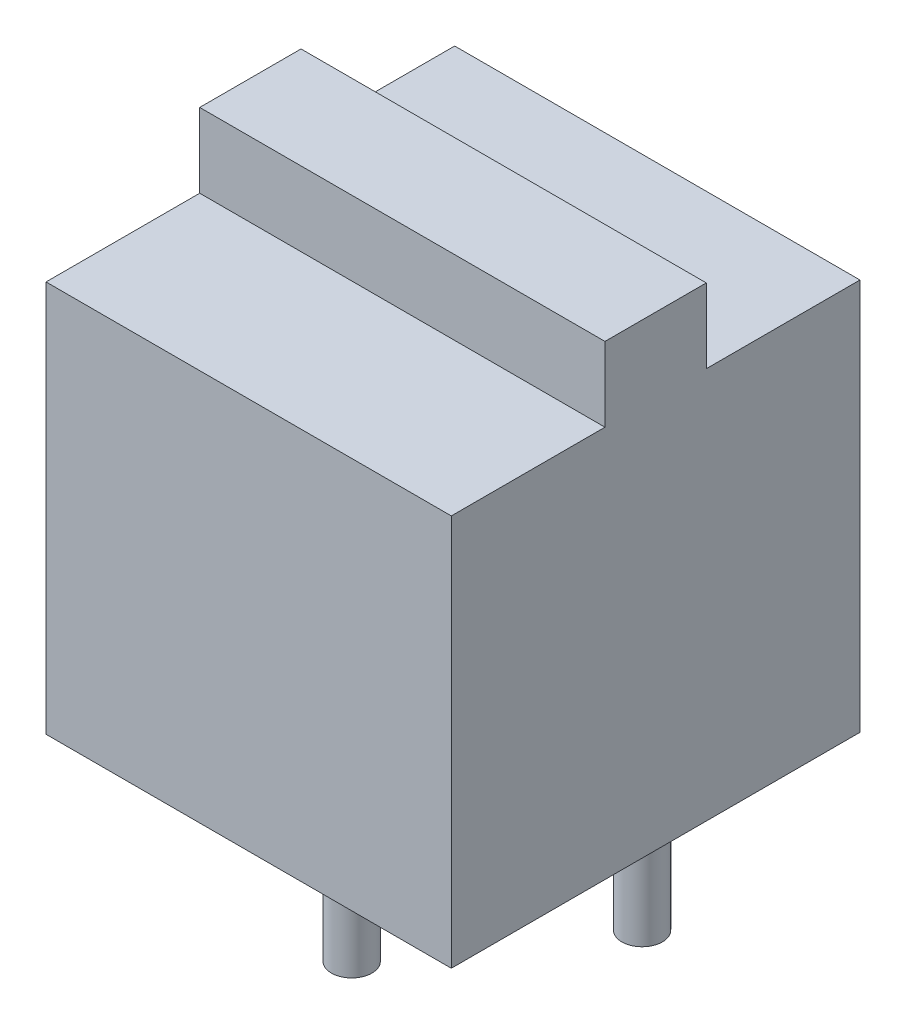
ISO-10303-21;
HEADER;
FILE_DESCRIPTION(('STEP AP214'),'2;1');
FILE_NAME('part.step','',(''),(''),'','','');
FILE_SCHEMA(('AUTOMOTIVE_DESIGN { 1 0 10303 214 1 1 1 1 }'));
ENDSEC;
DATA;
#1=APPLICATION_CONTEXT('core data for automotive mechanical design processes');
#2=APPLICATION_PROTOCOL_DEFINITION('international standard','automotive_design',2000,#1);
#3=PRODUCT_CONTEXT('',#1,'mechanical');
#4=PRODUCT('Part','Part','',(#3));
#5=PRODUCT_RELATED_PRODUCT_CATEGORY('part','',(#4));
#6=PRODUCT_DEFINITION_FORMATION('','',#4);
#7=PRODUCT_DEFINITION_CONTEXT('part definition',#1,'design');
#8=PRODUCT_DEFINITION('design','',#6,#7);
#9=PRODUCT_DEFINITION_SHAPE('','',#8);
#10=(LENGTH_UNIT() NAMED_UNIT(*) SI_UNIT(.MILLI.,.METRE.));
#11=(NAMED_UNIT(*) PLANE_ANGLE_UNIT() SI_UNIT($,.RADIAN.));
#12=(NAMED_UNIT(*) SI_UNIT($,.STERADIAN.) SOLID_ANGLE_UNIT());
#13=UNCERTAINTY_MEASURE_WITH_UNIT(LENGTH_MEASURE(1.E-05),#10,'distance_accuracy_value','');
#14=(GEOMETRIC_REPRESENTATION_CONTEXT(3) GLOBAL_UNCERTAINTY_ASSIGNED_CONTEXT((#13)) GLOBAL_UNIT_ASSIGNED_CONTEXT((#10,
#11,#12)) REPRESENTATION_CONTEXT('',''));
#15=CARTESIAN_POINT('',(0.,0.,0.));
#16=DIRECTION('',(0.,0.,1.));
#17=DIRECTION('',(1.,0.,0.));
#18=AXIS2_PLACEMENT_3D('',#15,#16,#17);
#19=CARTESIAN_POINT('',(0.,11.6,0.));
#20=DIRECTION('',(0.,-1.,0.));
#21=DIRECTION('',(0.,0.,-1.));
#22=AXIS2_PLACEMENT_3D('',#19,#20,#21);
#23=PLANE('',#22);
#24=DIRECTION('',(1.,0.,0.));
#25=VECTOR('',#24,1.);
#26=CARTESIAN_POINT('',(-6.,11.6,1.5));
#27=LINE('',#26,#25);
#28=CARTESIAN_POINT('',(-6.,11.6,1.5));
#29=VERTEX_POINT('',#28);
#30=CARTESIAN_POINT('',(6.,11.6,1.5));
#31=VERTEX_POINT('',#30);
#32=EDGE_CURVE('E55',#29,#31,#27,.T.);
#33=ORIENTED_EDGE('',*,*,#32,.F.);
#34=DIRECTION('',(0.,0.,1.));
#35=VECTOR('',#34,1.);
#36=CARTESIAN_POINT('',(-6.,11.6,6.05));
#37=LINE('',#36,#35);
#38=CARTESIAN_POINT('',(-6.,11.6,6.05));
#39=VERTEX_POINT('',#38);
#40=EDGE_CURVE('E147',#29,#39,#37,.T.);
#41=ORIENTED_EDGE('',*,*,#40,.T.);
#42=DIRECTION('',(1.,0.,0.));
#43=VECTOR('',#42,1.);
#44=CARTESIAN_POINT('',(-6.,11.6,6.05));
#45=LINE('',#44,#43);
#46=CARTESIAN_POINT('',(6.,11.6,6.05));
#47=VERTEX_POINT('',#46);
#48=EDGE_CURVE('E151',#39,#47,#45,.T.);
#49=ORIENTED_EDGE('',*,*,#48,.T.);
#50=DIRECTION('',(0.,0.,-1.));
#51=VECTOR('',#50,1.);
#52=CARTESIAN_POINT('',(6.,11.6,6.05));
#53=LINE('',#52,#51);
#54=EDGE_CURVE('E141',#47,#31,#53,.T.);
#55=ORIENTED_EDGE('',*,*,#54,.T.);
#56=EDGE_LOOP('',(#33,#41,#49,#55));
#57=FACE_BOUND('',#56,.T.);
#58=ADVANCED_FACE('F39',(#57),#23,.F.);
#59=DIRECTION('',(-1.,0.,0.));
#60=VECTOR('',#59,1.);
#61=CARTESIAN_POINT('',(-6.,11.6,-1.5));
#62=LINE('',#61,#60);
#63=CARTESIAN_POINT('',(6.,11.6,-1.5));
#64=VERTEX_POINT('',#63);
#65=CARTESIAN_POINT('',(-6.,11.6,-1.5));
#66=VERTEX_POINT('',#65);
#67=EDGE_CURVE('E63',#64,#66,#62,.T.);
#68=ORIENTED_EDGE('',*,*,#67,.F.);
#69=CARTESIAN_POINT('',(6.,11.6,-6.05));
#70=VERTEX_POINT('',#69);
#71=EDGE_CURVE('E129',#64,#70,#53,.T.);
#72=ORIENTED_EDGE('',*,*,#71,.T.);
#73=DIRECTION('',(-1.,0.,0.));
#74=VECTOR('',#73,1.);
#75=CARTESIAN_POINT('',(-6.,11.6,-6.05));
#76=LINE('',#75,#74);
#77=CARTESIAN_POINT('',(-6.,11.6,-6.05));
#78=VERTEX_POINT('',#77);
#79=EDGE_CURVE('E144',#70,#78,#76,.T.);
#80=ORIENTED_EDGE('',*,*,#79,.T.);
#81=EDGE_CURVE('E148',#78,#66,#37,.T.);
#82=ORIENTED_EDGE('',*,*,#81,.T.);
#83=EDGE_LOOP('',(#68,#72,#80,#82));
#84=FACE_BOUND('',#83,.T.);
#85=ADVANCED_FACE('F261',(#84),#23,.F.);
#86=CARTESIAN_POINT('',(6.,11.6,6.05));
#87=DIRECTION('',(-1.,0.,0.));
#88=DIRECTION('',(0.,0.,1.));
#89=AXIS2_PLACEMENT_3D('',#86,#87,#88);
#90=PLANE('',#89);
#91=DIRECTION('',(0.,0.,-1.));
#92=VECTOR('',#91,1.);
#93=CARTESIAN_POINT('',(6.,0.,6.05));
#94=LINE('',#93,#92);
#95=CARTESIAN_POINT('',(6.,0.,6.05));
#96=VERTEX_POINT('',#95);
#97=CARTESIAN_POINT('',(6.,0.,-6.05));
#98=VERTEX_POINT('',#97);
#99=EDGE_CURVE('E131',#96,#98,#94,.T.);
#100=ORIENTED_EDGE('',*,*,#99,.T.);
#101=DIRECTION('',(0.,-1.,0.));
#102=VECTOR('',#101,1.);
#103=CARTESIAN_POINT('',(6.,11.6,-6.05));
#104=LINE('',#103,#102);
#105=EDGE_CURVE('E11',#70,#98,#104,.T.);
#106=ORIENTED_EDGE('',*,*,#105,.F.);
#107=ORIENTED_EDGE('',*,*,#71,.F.);
#108=DIRECTION('',(0.,-1.,0.));
#109=VECTOR('',#108,1.);
#110=CARTESIAN_POINT('',(6.,13.8,-1.5));
#111=LINE('',#110,#109);
#112=CARTESIAN_POINT('',(6.,13.8,-1.5));
#113=VERTEX_POINT('',#112);
#114=EDGE_CURVE('E109',#113,#64,#111,.T.);
#115=ORIENTED_EDGE('',*,*,#114,.F.);
#116=DIRECTION('',(0.,0.,-1.));
#117=VECTOR('',#116,1.);
#118=CARTESIAN_POINT('',(6.,13.8,1.5));
#119=LINE('',#118,#117);
#120=CARTESIAN_POINT('',(6.,13.8,1.5));
#121=VERTEX_POINT('',#120);
#122=EDGE_CURVE('E116',#121,#113,#119,.T.);
#123=ORIENTED_EDGE('',*,*,#122,.F.);
#124=DIRECTION('',(0.,-1.,0.));
#125=VECTOR('',#124,1.);
#126=CARTESIAN_POINT('',(6.,13.8,1.5));
#127=LINE('',#126,#125);
#128=EDGE_CURVE('E188',#121,#31,#127,.T.);
#129=ORIENTED_EDGE('',*,*,#128,.T.);
#130=ORIENTED_EDGE('',*,*,#54,.F.);
#131=DIRECTION('',(0.,-1.,0.));
#132=VECTOR('',#131,1.);
#133=CARTESIAN_POINT('',(6.,11.6,6.05));
#134=LINE('',#133,#132);
#135=EDGE_CURVE('E153',#47,#96,#134,.T.);
#136=ORIENTED_EDGE('',*,*,#135,.T.);
#137=EDGE_LOOP('',(#100,#106,#107,#115,#123,#129,#130,#136));
#138=FACE_BOUND('',#137,.T.);
#139=ADVANCED_FACE('F41',(#138),#90,.F.);
#140=CARTESIAN_POINT('',(-6.,11.6,-6.05));
#141=DIRECTION('',(0.,0.,1.));
#142=DIRECTION('',(1.,0.,0.));
#143=AXIS2_PLACEMENT_3D('',#140,#141,#142);
#144=PLANE('',#143);
#145=DIRECTION('',(-1.,0.,0.));
#146=VECTOR('',#145,1.);
#147=CARTESIAN_POINT('',(-6.,0.,-6.05));
#148=LINE('',#147,#146);
#149=CARTESIAN_POINT('',(-6.,0.,-6.05));
#150=VERTEX_POINT('',#149);
#151=EDGE_CURVE('E135',#98,#150,#148,.T.);
#152=ORIENTED_EDGE('',*,*,#151,.T.);
#153=DIRECTION('',(0.,-1.,0.));
#154=VECTOR('',#153,1.);
#155=CARTESIAN_POINT('',(-6.,11.6,-6.05));
#156=LINE('',#155,#154);
#157=EDGE_CURVE('E48',#78,#150,#156,.T.);
#158=ORIENTED_EDGE('',*,*,#157,.F.);
#159=ORIENTED_EDGE('',*,*,#79,.F.);
#160=ORIENTED_EDGE('',*,*,#105,.T.);
#161=EDGE_LOOP('',(#152,#158,#159,#160));
#162=FACE_BOUND('',#161,.T.);
#163=ADVANCED_FACE('F272',(#162),#144,.F.);
#164=CARTESIAN_POINT('',(-6.,11.6,6.05));
#165=DIRECTION('',(1.,0.,0.));
#166=DIRECTION('',(0.,0.,-1.));
#167=AXIS2_PLACEMENT_3D('',#164,#165,#166);
#168=PLANE('',#167);
#169=DIRECTION('',(0.,0.,1.));
#170=VECTOR('',#169,1.);
#171=CARTESIAN_POINT('',(-6.,0.,6.05));
#172=LINE('',#171,#170);
#173=CARTESIAN_POINT('',(-6.,0.,6.05));
#174=VERTEX_POINT('',#173);
#175=EDGE_CURVE('E157',#150,#174,#172,.T.);
#176=ORIENTED_EDGE('',*,*,#175,.T.);
#177=DIRECTION('',(0.,-1.,0.));
#178=VECTOR('',#177,1.);
#179=CARTESIAN_POINT('',(-6.,11.6,6.05));
#180=LINE('',#179,#178);
#181=EDGE_CURVE('E166',#39,#174,#180,.T.);
#182=ORIENTED_EDGE('',*,*,#181,.F.);
#183=ORIENTED_EDGE('',*,*,#40,.F.);
#184=DIRECTION('',(0.,-1.,0.));
#185=VECTOR('',#184,1.);
#186=CARTESIAN_POINT('',(-6.,13.8,1.5));
#187=LINE('',#186,#185);
#188=CARTESIAN_POINT('',(-6.,13.8,1.5));
#189=VERTEX_POINT('',#188);
#190=EDGE_CURVE('E137',#189,#29,#187,.T.);
#191=ORIENTED_EDGE('',*,*,#190,.F.);
#192=DIRECTION('',(0.,0.,1.));
#193=VECTOR('',#192,1.);
#194=CARTESIAN_POINT('',(-6.,13.8,1.5));
#195=LINE('',#194,#193);
#196=CARTESIAN_POINT('',(-6.,13.8,-1.5));
#197=VERTEX_POINT('',#196);
#198=EDGE_CURVE('E115',#197,#189,#195,.T.);
#199=ORIENTED_EDGE('',*,*,#198,.F.);
#200=DIRECTION('',(0.,-1.,0.));
#201=VECTOR('',#200,1.);
#202=CARTESIAN_POINT('',(-6.,13.8,-1.5));
#203=LINE('',#202,#201);
#204=EDGE_CURVE('E111',#197,#66,#203,.T.);
#205=ORIENTED_EDGE('',*,*,#204,.T.);
#206=ORIENTED_EDGE('',*,*,#81,.F.);
#207=ORIENTED_EDGE('',*,*,#157,.T.);
#208=EDGE_LOOP('',(#176,#182,#183,#191,#199,#205,#206,#207));
#209=FACE_BOUND('',#208,.T.);
#210=ADVANCED_FACE('F175',(#209),#168,.F.);
#211=CARTESIAN_POINT('',(-6.,11.6,6.05));
#212=DIRECTION('',(0.,0.,-1.));
#213=DIRECTION('',(-1.,0.,0.));
#214=AXIS2_PLACEMENT_3D('',#211,#212,#213);
#215=PLANE('',#214);
#216=DIRECTION('',(1.,0.,0.));
#217=VECTOR('',#216,1.);
#218=CARTESIAN_POINT('',(-6.,0.,6.05));
#219=LINE('',#218,#217);
#220=EDGE_CURVE('E160',#174,#96,#219,.T.);
#221=ORIENTED_EDGE('',*,*,#220,.T.);
#222=ORIENTED_EDGE('',*,*,#135,.F.);
#223=ORIENTED_EDGE('',*,*,#48,.F.);
#224=ORIENTED_EDGE('',*,*,#181,.T.);
#225=EDGE_LOOP('',(#221,#222,#223,#224));
#226=FACE_BOUND('',#225,.T.);
#227=ADVANCED_FACE('F185',(#226),#215,.F.);
#228=CARTESIAN_POINT('',(0.,0.,0.));
#229=DIRECTION('',(0.,-1.,0.));
#230=DIRECTION('',(0.,0.,-1.));
#231=AXIS2_PLACEMENT_3D('',#228,#229,#230);
#232=PLANE('',#231);
#233=CARTESIAN_POINT('',(4.25,0.,-1.35));
#234=DIRECTION('',(0.,-1.,0.));
#235=DIRECTION('',(0.,0.,-1.));
#236=AXIS2_PLACEMENT_3D('',#233,#234,#235);
#237=CIRCLE('',#236,0.6);
#238=CARTESIAN_POINT('',(4.25,0.,-1.95));
#239=VERTEX_POINT('',#238);
#240=EDGE_CURVE('E222',#239,#239,#237,.T.);
#241=ORIENTED_EDGE('',*,*,#240,.F.);
#242=EDGE_LOOP('',(#241));
#243=FACE_BOUND('',#242,.T.);
#244=CARTESIAN_POINT('',(0.749999999999999,0.,3.75));
#245=DIRECTION('',(0.,-1.,0.));
#246=DIRECTION('',(0.,0.,-1.));
#247=AXIS2_PLACEMENT_3D('',#244,#245,#246);
#248=CIRCLE('',#247,0.6);
#249=CARTESIAN_POINT('',(0.749999999999999,0.,3.15));
#250=VERTEX_POINT('',#249);
#251=EDGE_CURVE('E214',#250,#250,#248,.T.);
#252=ORIENTED_EDGE('',*,*,#251,.F.);
#253=EDGE_LOOP('',(#252));
#254=FACE_BOUND('',#253,.T.);
#255=CARTESIAN_POINT('',(-2.75,0.,-1.35));
#256=DIRECTION('',(0.,-1.,0.));
#257=DIRECTION('',(0.,0.,-1.));
#258=AXIS2_PLACEMENT_3D('',#255,#256,#257);
#259=CIRCLE('',#258,0.6);
#260=CARTESIAN_POINT('',(-2.75,0.,-1.95));
#261=VERTEX_POINT('',#260);
#262=EDGE_CURVE('E206',#261,#261,#259,.T.);
#263=ORIENTED_EDGE('',*,*,#262,.F.);
#264=EDGE_LOOP('',(#263));
#265=FACE_BOUND('',#264,.T.);
#266=ORIENTED_EDGE('',*,*,#99,.F.);
#267=ORIENTED_EDGE('',*,*,#220,.F.);
#268=ORIENTED_EDGE('',*,*,#175,.F.);
#269=ORIENTED_EDGE('',*,*,#151,.F.);
#270=EDGE_LOOP('',(#266,#267,#268,#269));
#271=FACE_BOUND('',#270,.T.);
#272=ADVANCED_FACE('F182',(#243,#254,#265,#271),#232,.T.);
#273=CARTESIAN_POINT('',(-6.,13.8,-1.5));
#274=DIRECTION('',(0.,0.,1.));
#275=DIRECTION('',(1.,0.,0.));
#276=AXIS2_PLACEMENT_3D('',#273,#274,#275);
#277=PLANE('',#276);
#278=ORIENTED_EDGE('',*,*,#67,.T.);
#279=ORIENTED_EDGE('',*,*,#204,.F.);
#280=DIRECTION('',(-1.,0.,0.));
#281=VECTOR('',#280,1.);
#282=CARTESIAN_POINT('',(-6.,13.8,-1.5));
#283=LINE('',#282,#281);
#284=EDGE_CURVE('E105',#113,#197,#283,.T.);
#285=ORIENTED_EDGE('',*,*,#284,.F.);
#286=ORIENTED_EDGE('',*,*,#114,.T.);
#287=EDGE_LOOP('',(#278,#279,#285,#286));
#288=FACE_BOUND('',#287,.T.);
#289=ADVANCED_FACE('F107',(#288),#277,.F.);
#290=CARTESIAN_POINT('',(-6.,13.8,1.5));
#291=DIRECTION('',(0.,0.,-1.));
#292=DIRECTION('',(-1.,0.,0.));
#293=AXIS2_PLACEMENT_3D('',#290,#291,#292);
#294=PLANE('',#293);
#295=ORIENTED_EDGE('',*,*,#32,.T.);
#296=ORIENTED_EDGE('',*,*,#128,.F.);
#297=DIRECTION('',(1.,0.,0.));
#298=VECTOR('',#297,1.);
#299=CARTESIAN_POINT('',(-6.,13.8,1.5));
#300=LINE('',#299,#298);
#301=EDGE_CURVE('E121',#189,#121,#300,.T.);
#302=ORIENTED_EDGE('',*,*,#301,.F.);
#303=ORIENTED_EDGE('',*,*,#190,.T.);
#304=EDGE_LOOP('',(#295,#296,#302,#303));
#305=FACE_BOUND('',#304,.T.);
#306=ADVANCED_FACE('F191',(#305),#294,.F.);
#307=CARTESIAN_POINT('',(0.,13.8,0.));
#308=DIRECTION('',(0.,-1.,0.));
#309=DIRECTION('',(0.,0.,-1.));
#310=AXIS2_PLACEMENT_3D('',#307,#308,#309);
#311=PLANE('',#310);
#312=ORIENTED_EDGE('',*,*,#122,.T.);
#313=ORIENTED_EDGE('',*,*,#284,.T.);
#314=ORIENTED_EDGE('',*,*,#198,.T.);
#315=ORIENTED_EDGE('',*,*,#301,.T.);
#316=EDGE_LOOP('',(#312,#313,#314,#315));
#317=FACE_BOUND('',#316,.T.);
#318=ADVANCED_FACE('F119',(#317),#311,.F.);
#319=CARTESIAN_POINT('',(-2.75,-3.6,-1.35));
#320=DIRECTION('',(0.,1.,0.));
#321=DIRECTION('',(0.,0.,1.));
#322=AXIS2_PLACEMENT_3D('',#319,#320,#321);
#323=CYLINDRICAL_SURFACE('',#322,0.6);
#324=CARTESIAN_POINT('',(-2.75,-3.6,-1.35));
#325=DIRECTION('',(0.,-1.,0.));
#326=DIRECTION('',(0.,0.,-1.));
#327=AXIS2_PLACEMENT_3D('',#324,#325,#326);
#328=CIRCLE('',#327,0.6);
#329=CARTESIAN_POINT('',(-2.75,-3.6,-1.95));
#330=VERTEX_POINT('',#329);
#331=EDGE_CURVE('E196',#330,#330,#328,.T.);
#332=ORIENTED_EDGE('',*,*,#331,.F.);
#333=EDGE_LOOP('',(#332));
#334=FACE_BOUND('',#333,.T.);
#335=ORIENTED_EDGE('',*,*,#262,.T.);
#336=EDGE_LOOP('',(#335));
#337=FACE_BOUND('',#336,.T.);
#338=ADVANCED_FACE('F246',(#334,#337),#323,.T.);
#339=CARTESIAN_POINT('',(-2.75,-3.6,-1.35));
#340=DIRECTION('',(0.,-1.,0.));
#341=DIRECTION('',(0.,0.,-1.));
#342=AXIS2_PLACEMENT_3D('',#339,#340,#341);
#343=PLANE('',#342);
#344=ORIENTED_EDGE('',*,*,#331,.T.);
#345=EDGE_LOOP('',(#344));
#346=FACE_BOUND('',#345,.T.);
#347=ADVANCED_FACE('F248',(#346),#343,.T.);
#348=CARTESIAN_POINT('',(0.749999999999999,-3.6,3.75));
#349=DIRECTION('',(0.,1.,0.));
#350=DIRECTION('',(0.,0.,1.));
#351=AXIS2_PLACEMENT_3D('',#348,#349,#350);
#352=CYLINDRICAL_SURFACE('',#351,0.6);
#353=CARTESIAN_POINT('',(0.749999999999999,-3.6,3.75));
#354=DIRECTION('',(0.,-1.,0.));
#355=DIRECTION('',(0.,0.,-1.));
#356=AXIS2_PLACEMENT_3D('',#353,#354,#355);
#357=CIRCLE('',#356,0.6);
#358=CARTESIAN_POINT('',(0.749999999999999,-3.6,3.15));
#359=VERTEX_POINT('',#358);
#360=EDGE_CURVE('E210',#359,#359,#357,.T.);
#361=ORIENTED_EDGE('',*,*,#360,.F.);
#362=EDGE_LOOP('',(#361));
#363=FACE_BOUND('',#362,.T.);
#364=ORIENTED_EDGE('',*,*,#251,.T.);
#365=EDGE_LOOP('',(#364));
#366=FACE_BOUND('',#365,.T.);
#367=ADVANCED_FACE('F255',(#363,#366),#352,.T.);
#368=CARTESIAN_POINT('',(0.749999999999999,-3.6,3.75));
#369=DIRECTION('',(0.,-1.,0.));
#370=DIRECTION('',(0.,0.,-1.));
#371=AXIS2_PLACEMENT_3D('',#368,#369,#370);
#372=PLANE('',#371);
#373=ORIENTED_EDGE('',*,*,#360,.T.);
#374=EDGE_LOOP('',(#373));
#375=FACE_BOUND('',#374,.T.);
#376=ADVANCED_FACE('F235',(#375),#372,.T.);
#377=CARTESIAN_POINT('',(4.25,-3.6,-1.35));
#378=DIRECTION('',(0.,1.,0.));
#379=DIRECTION('',(0.,0.,1.));
#380=AXIS2_PLACEMENT_3D('',#377,#378,#379);
#381=CYLINDRICAL_SURFACE('',#380,0.6);
#382=CARTESIAN_POINT('',(4.25,-3.6,-1.35));
#383=DIRECTION('',(0.,-1.,0.));
#384=DIRECTION('',(0.,0.,-1.));
#385=AXIS2_PLACEMENT_3D('',#382,#383,#384);
#386=CIRCLE('',#385,0.6);
#387=CARTESIAN_POINT('',(4.25,-3.6,-1.95));
#388=VERTEX_POINT('',#387);
#389=EDGE_CURVE('E218',#388,#388,#386,.T.);
#390=ORIENTED_EDGE('',*,*,#389,.F.);
#391=EDGE_LOOP('',(#390));
#392=FACE_BOUND('',#391,.T.);
#393=ORIENTED_EDGE('',*,*,#240,.T.);
#394=EDGE_LOOP('',(#393));
#395=FACE_BOUND('',#394,.T.);
#396=ADVANCED_FACE('F232',(#392,#395),#381,.T.);
#397=CARTESIAN_POINT('',(4.25,-3.6,-1.35));
#398=DIRECTION('',(0.,-1.,0.));
#399=DIRECTION('',(0.,0.,-1.));
#400=AXIS2_PLACEMENT_3D('',#397,#398,#399);
#401=PLANE('',#400);
#402=ORIENTED_EDGE('',*,*,#389,.T.);
#403=EDGE_LOOP('',(#402));
#404=FACE_BOUND('',#403,.T.);
#405=ADVANCED_FACE('F230',(#404),#401,.T.);
#406=CLOSED_SHELL('',(#58,#85,#139,#163,#210,#227,#272,#289,#306,#318,#338,#347,#367,#376,#396,#405));
#407=MANIFOLD_SOLID_BREP('B2',#406);
#408=ADVANCED_BREP_SHAPE_REPRESENTATION('',(#18,#407),#14);
#409=SHAPE_DEFINITION_REPRESENTATION(#9,#408);
ENDSEC;
END-ISO-10303-21;
